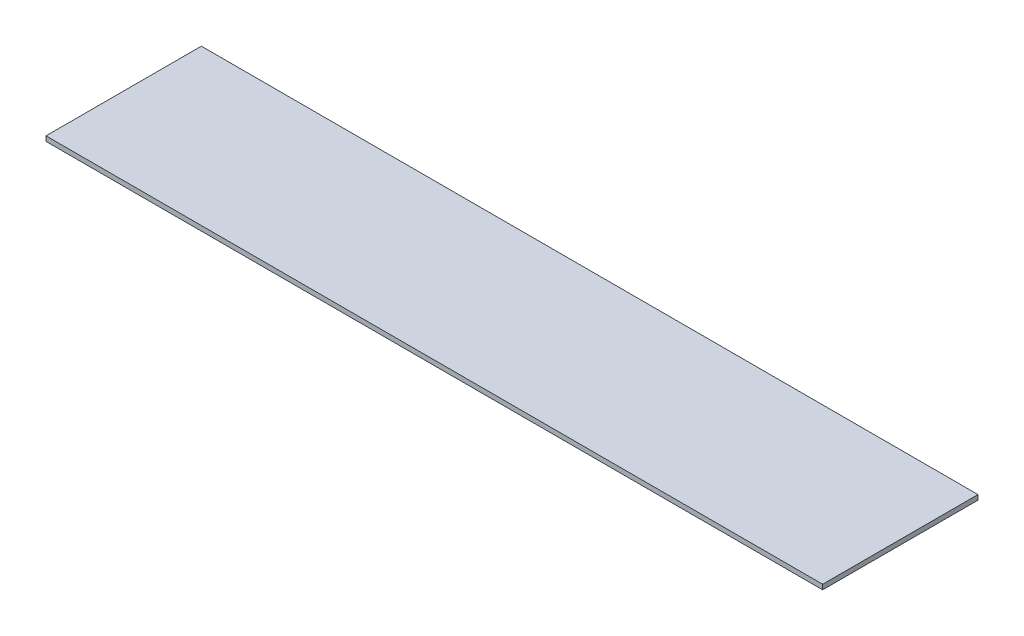
ISO-10303-21;
HEADER;
FILE_DESCRIPTION(('STEP AP214'),'2;1');
FILE_NAME('part.step','',(''),(''),'','','');
FILE_SCHEMA(('AUTOMOTIVE_DESIGN { 1 0 10303 214 1 1 1 1 }'));
ENDSEC;
DATA;
#1=APPLICATION_CONTEXT('core data for automotive mechanical design processes');
#2=APPLICATION_PROTOCOL_DEFINITION('international standard','automotive_design',2000,#1);
#3=PRODUCT_CONTEXT('',#1,'mechanical');
#4=PRODUCT('Part','Part','',(#3));
#5=PRODUCT_RELATED_PRODUCT_CATEGORY('part','',(#4));
#6=PRODUCT_DEFINITION_FORMATION('','',#4);
#7=PRODUCT_DEFINITION_CONTEXT('part definition',#1,'design');
#8=PRODUCT_DEFINITION('design','',#6,#7);
#9=PRODUCT_DEFINITION_SHAPE('','',#8);
#10=(LENGTH_UNIT() NAMED_UNIT(*) SI_UNIT(.MILLI.,.METRE.));
#11=(NAMED_UNIT(*) PLANE_ANGLE_UNIT() SI_UNIT($,.RADIAN.));
#12=(NAMED_UNIT(*) SI_UNIT($,.STERADIAN.) SOLID_ANGLE_UNIT());
#13=UNCERTAINTY_MEASURE_WITH_UNIT(LENGTH_MEASURE(1.E-05),#10,'distance_accuracy_value','');
#14=(GEOMETRIC_REPRESENTATION_CONTEXT(3) GLOBAL_UNCERTAINTY_ASSIGNED_CONTEXT((#13)) GLOBAL_UNIT_ASSIGNED_CONTEXT((#10,
#11,#12)) REPRESENTATION_CONTEXT('',''));
#15=CARTESIAN_POINT('',(0.,0.,0.));
#16=DIRECTION('',(0.,0.,1.));
#17=DIRECTION('',(1.,0.,0.));
#18=AXIS2_PLACEMENT_3D('',#15,#16,#17);
#19=CARTESIAN_POINT('',(254.,1.5875,50.8));
#20=DIRECTION('',(-1.,0.,0.));
#21=DIRECTION('',(0.,0.,1.));
#22=AXIS2_PLACEMENT_3D('',#19,#20,#21);
#23=PLANE('',#22);
#24=DIRECTION('',(0.,0.,-1.));
#25=VECTOR('',#24,1.);
#26=CARTESIAN_POINT('',(254.,-1.5875,50.8));
#27=LINE('',#26,#25);
#28=CARTESIAN_POINT('',(254.,-1.5875,50.8));
#29=VERTEX_POINT('',#28);
#30=CARTESIAN_POINT('',(254.,-1.5875,-50.8));
#31=VERTEX_POINT('',#30);
#32=EDGE_CURVE('E107',#29,#31,#27,.T.);
#33=ORIENTED_EDGE('',*,*,#32,.T.);
#34=DIRECTION('',(0.,-1.,0.));
#35=VECTOR('',#34,1.);
#36=CARTESIAN_POINT('',(254.,1.5875,-50.8));
#37=LINE('',#36,#35);
#38=CARTESIAN_POINT('',(254.,1.5875,-50.8));
#39=VERTEX_POINT('',#38);
#40=EDGE_CURVE('E11',#39,#31,#37,.T.);
#41=ORIENTED_EDGE('',*,*,#40,.F.);
#42=DIRECTION('',(0.,0.,-1.));
#43=VECTOR('',#42,1.);
#44=CARTESIAN_POINT('',(254.,1.5875,50.8));
#45=LINE('',#44,#43);
#46=CARTESIAN_POINT('',(254.,1.5875,50.8));
#47=VERTEX_POINT('',#46);
#48=EDGE_CURVE('E91',#47,#39,#45,.T.);
#49=ORIENTED_EDGE('',*,*,#48,.F.);
#50=DIRECTION('',(0.,-1.,0.));
#51=VECTOR('',#50,1.);
#52=CARTESIAN_POINT('',(254.,1.5875,50.8));
#53=LINE('',#52,#51);
#54=EDGE_CURVE('E103',#47,#29,#53,.T.);
#55=ORIENTED_EDGE('',*,*,#54,.T.);
#56=EDGE_LOOP('',(#33,#41,#49,#55));
#57=FACE_BOUND('',#56,.T.);
#58=ADVANCED_FACE('F39',(#57),#23,.F.);
#59=CARTESIAN_POINT('',(-254.,1.5875,-50.8));
#60=DIRECTION('',(0.,0.,1.));
#61=DIRECTION('',(1.,0.,0.));
#62=AXIS2_PLACEMENT_3D('',#59,#60,#61);
#63=PLANE('',#62);
#64=DIRECTION('',(-1.,0.,0.));
#65=VECTOR('',#64,1.);
#66=CARTESIAN_POINT('',(-254.,-1.5875,-50.8));
#67=LINE('',#66,#65);
#68=CARTESIAN_POINT('',(-254.,-1.5875,-50.8));
#69=VERTEX_POINT('',#68);
#70=EDGE_CURVE('E96',#31,#69,#67,.T.);
#71=ORIENTED_EDGE('',*,*,#70,.T.);
#72=DIRECTION('',(0.,-1.,0.));
#73=VECTOR('',#72,1.);
#74=CARTESIAN_POINT('',(-254.,1.5875,-50.8));
#75=LINE('',#74,#73);
#76=CARTESIAN_POINT('',(-254.,1.5875,-50.8));
#77=VERTEX_POINT('',#76);
#78=EDGE_CURVE('E48',#77,#69,#75,.T.);
#79=ORIENTED_EDGE('',*,*,#78,.F.);
#80=DIRECTION('',(-1.,0.,0.));
#81=VECTOR('',#80,1.);
#82=CARTESIAN_POINT('',(-254.,1.5875,-50.8));
#83=LINE('',#82,#81);
#84=EDGE_CURVE('E86',#39,#77,#83,.T.);
#85=ORIENTED_EDGE('',*,*,#84,.F.);
#86=ORIENTED_EDGE('',*,*,#40,.T.);
#87=EDGE_LOOP('',(#71,#79,#85,#86));
#88=FACE_BOUND('',#87,.T.);
#89=ADVANCED_FACE('F95',(#88),#63,.F.);
#90=CARTESIAN_POINT('',(-254.,1.5875,50.8));
#91=DIRECTION('',(1.,0.,0.));
#92=DIRECTION('',(0.,0.,-1.));
#93=AXIS2_PLACEMENT_3D('',#90,#91,#92);
#94=PLANE('',#93);
#95=DIRECTION('',(0.,0.,1.));
#96=VECTOR('',#95,1.);
#97=CARTESIAN_POINT('',(-254.,-1.5875,50.8));
#98=LINE('',#97,#96);
#99=CARTESIAN_POINT('',(-254.,-1.5875,50.8));
#100=VERTEX_POINT('',#99);
#101=EDGE_CURVE('E73',#69,#100,#98,.T.);
#102=ORIENTED_EDGE('',*,*,#101,.T.);
#103=DIRECTION('',(0.,-1.,0.));
#104=VECTOR('',#103,1.);
#105=CARTESIAN_POINT('',(-254.,1.5875,50.8));
#106=LINE('',#105,#104);
#107=CARTESIAN_POINT('',(-254.,1.5875,50.8));
#108=VERTEX_POINT('',#107);
#109=EDGE_CURVE('E98',#108,#100,#106,.T.);
#110=ORIENTED_EDGE('',*,*,#109,.F.);
#111=DIRECTION('',(0.,0.,1.));
#112=VECTOR('',#111,1.);
#113=CARTESIAN_POINT('',(-254.,1.5875,50.8));
#114=LINE('',#113,#112);
#115=EDGE_CURVE('E89',#77,#108,#114,.T.);
#116=ORIENTED_EDGE('',*,*,#115,.F.);
#117=ORIENTED_EDGE('',*,*,#78,.T.);
#118=EDGE_LOOP('',(#102,#110,#116,#117));
#119=FACE_BOUND('',#118,.T.);
#120=ADVANCED_FACE('F99',(#119),#94,.F.);
#121=CARTESIAN_POINT('',(-254.,1.5875,50.8));
#122=DIRECTION('',(0.,0.,-1.));
#123=DIRECTION('',(-1.,0.,0.));
#124=AXIS2_PLACEMENT_3D('',#121,#122,#123);
#125=PLANE('',#124);
#126=DIRECTION('',(1.,0.,0.));
#127=VECTOR('',#126,1.);
#128=CARTESIAN_POINT('',(-254.,-1.5875,50.8));
#129=LINE('',#128,#127);
#130=EDGE_CURVE('E79',#100,#29,#129,.T.);
#131=ORIENTED_EDGE('',*,*,#130,.T.);
#132=ORIENTED_EDGE('',*,*,#54,.F.);
#133=DIRECTION('',(1.,0.,0.));
#134=VECTOR('',#133,1.);
#135=CARTESIAN_POINT('',(-254.,1.5875,50.8));
#136=LINE('',#135,#134);
#137=EDGE_CURVE('E56',#108,#47,#136,.T.);
#138=ORIENTED_EDGE('',*,*,#137,.F.);
#139=ORIENTED_EDGE('',*,*,#109,.T.);
#140=EDGE_LOOP('',(#131,#132,#138,#139));
#141=FACE_BOUND('',#140,.T.);
#142=ADVANCED_FACE('F120',(#141),#125,.F.);
#143=CARTESIAN_POINT('',(0.,1.5875,0.));
#144=DIRECTION('',(0.,-1.,0.));
#145=DIRECTION('',(0.,0.,-1.));
#146=AXIS2_PLACEMENT_3D('',#143,#144,#145);
#147=PLANE('',#146);
#148=ORIENTED_EDGE('',*,*,#48,.T.);
#149=ORIENTED_EDGE('',*,*,#84,.T.);
#150=ORIENTED_EDGE('',*,*,#115,.T.);
#151=ORIENTED_EDGE('',*,*,#137,.T.);
#152=EDGE_LOOP('',(#148,#149,#150,#151));
#153=FACE_BOUND('',#152,.T.);
#154=ADVANCED_FACE('F87',(#153),#147,.F.);
#155=CARTESIAN_POINT('',(0.,-1.5875,0.));
#156=DIRECTION('',(0.,-1.,0.));
#157=DIRECTION('',(0.,0.,-1.));
#158=AXIS2_PLACEMENT_3D('',#155,#156,#157);
#159=PLANE('',#158);
#160=ORIENTED_EDGE('',*,*,#32,.F.);
#161=ORIENTED_EDGE('',*,*,#130,.F.);
#162=ORIENTED_EDGE('',*,*,#101,.F.);
#163=ORIENTED_EDGE('',*,*,#70,.F.);
#164=EDGE_LOOP('',(#160,#161,#162,#163));
#165=FACE_BOUND('',#164,.T.);
#166=ADVANCED_FACE('F123',(#165),#159,.T.);
#167=CLOSED_SHELL('',(#58,#89,#120,#142,#154,#166));
#168=MANIFOLD_SOLID_BREP('B2',#167);
#169=ADVANCED_BREP_SHAPE_REPRESENTATION('',(#18,#168),#14);
#170=SHAPE_DEFINITION_REPRESENTATION(#9,#169);
ENDSEC;
END-ISO-10303-21;
